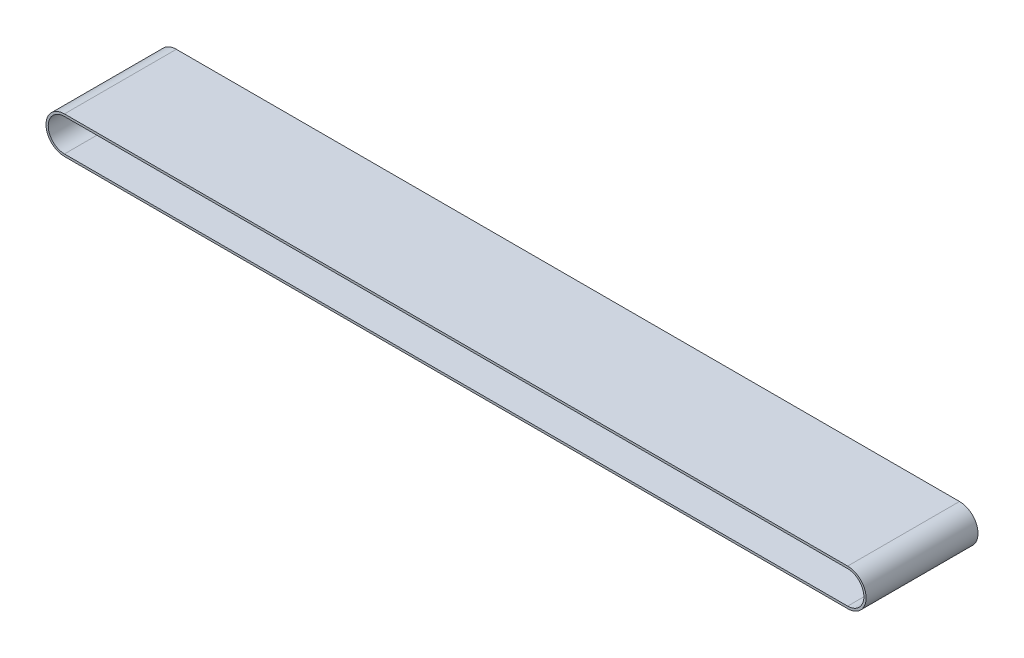
ISO-10303-21;
HEADER;
FILE_DESCRIPTION(('STEP AP214'),'2;1');
FILE_NAME('part.step','',(''),(''),'','','');
FILE_SCHEMA(('AUTOMOTIVE_DESIGN { 1 0 10303 214 1 1 1 1 }'));
ENDSEC;
DATA;
#1=APPLICATION_CONTEXT('core data for automotive mechanical design processes');
#2=APPLICATION_PROTOCOL_DEFINITION('international standard','automotive_design',2000,#1);
#3=PRODUCT_CONTEXT('',#1,'mechanical');
#4=PRODUCT('Part','Part','',(#3));
#5=PRODUCT_RELATED_PRODUCT_CATEGORY('part','',(#4));
#6=PRODUCT_DEFINITION_FORMATION('','',#4);
#7=PRODUCT_DEFINITION_CONTEXT('part definition',#1,'design');
#8=PRODUCT_DEFINITION('design','',#6,#7);
#9=PRODUCT_DEFINITION_SHAPE('','',#8);
#10=(LENGTH_UNIT() NAMED_UNIT(*) SI_UNIT(.MILLI.,.METRE.));
#11=(NAMED_UNIT(*) PLANE_ANGLE_UNIT() SI_UNIT($,.RADIAN.));
#12=(NAMED_UNIT(*) SI_UNIT($,.STERADIAN.) SOLID_ANGLE_UNIT());
#13=UNCERTAINTY_MEASURE_WITH_UNIT(LENGTH_MEASURE(1.E-05),#10,'distance_accuracy_value','');
#14=(GEOMETRIC_REPRESENTATION_CONTEXT(3) GLOBAL_UNCERTAINTY_ASSIGNED_CONTEXT((#13)) GLOBAL_UNIT_ASSIGNED_CONTEXT((#10,
#11,#12)) REPRESENTATION_CONTEXT('',''));
#15=CARTESIAN_POINT('',(0.,0.,0.));
#16=DIRECTION('',(0.,0.,1.));
#17=DIRECTION('',(1.,0.,0.));
#18=AXIS2_PLACEMENT_3D('',#15,#16,#17);
#19=CARTESIAN_POINT('',(-2.56045185054177E-12,-3.33066907387547E-13,50.));
#20=DIRECTION('',(0.,0.,-1.));
#21=DIRECTION('',(-1.,0.,0.));
#22=AXIS2_PLACEMENT_3D('',#19,#20,#21);
#23=PLANE('',#22);
#24=CARTESIAN_POINT('',(-2.56045185054177E-12,-3.33066907387547E-13,50.));
#25=DIRECTION('',(0.,0.,-1.));
#26=DIRECTION('',(-1.,0.,0.));
#27=AXIS2_PLACEMENT_3D('',#24,#25,#26);
#28=CIRCLE('',#27,16.5);
#29=CARTESIAN_POINT('',(-2.5630688048141E-12,-16.5000000000003,50.));
#30=VERTEX_POINT('',#29);
#31=CARTESIAN_POINT('',(-2.55351295663786E-12,16.4999999999997,50.));
#32=VERTEX_POINT('',#31);
#33=EDGE_CURVE('E157',#30,#32,#28,.F.);
#34=ORIENTED_EDGE('',*,*,#33,.T.);
#35=DIRECTION('',(-1.,0.,0.));
#36=VECTOR('',#35,1.);
#37=CARTESIAN_POINT('',(-2.55783489626944E-12,16.4999999999997,50.));
#38=LINE('',#37,#36);
#39=CARTESIAN_POINT('',(-700.,16.4999999999998,50.));
#40=VERTEX_POINT('',#39);
#41=EDGE_CURVE('E160',#32,#40,#38,.T.);
#42=ORIENTED_EDGE('',*,*,#41,.T.);
#43=CARTESIAN_POINT('',(-700.,-2.22044604925031E-13,50.));
#44=DIRECTION('',(0.,0.,-1.));
#45=DIRECTION('',(-1.,0.,0.));
#46=AXIS2_PLACEMENT_3D('',#43,#44,#45);
#47=CIRCLE('',#46,16.5);
#48=CARTESIAN_POINT('',(-700.,-16.5000000000002,50.));
#49=VERTEX_POINT('',#48);
#50=EDGE_CURVE('E163',#40,#49,#47,.F.);
#51=ORIENTED_EDGE('',*,*,#50,.T.);
#52=DIRECTION('',(1.,0.,0.));
#53=VECTOR('',#52,1.);
#54=CARTESIAN_POINT('',(-2.5630688048141E-12,-16.5000000000003,50.));
#55=LINE('',#54,#53);
#56=EDGE_CURVE('E165',#49,#30,#55,.T.);
#57=ORIENTED_EDGE('',*,*,#56,.T.);
#58=EDGE_LOOP('',(#34,#42,#51,#57));
#59=FACE_BOUND('',#58,.T.);
#60=CARTESIAN_POINT('',(-2.56045185054177E-12,-3.33066907387547E-13,50.));
#61=DIRECTION('',(0.,0.,1.));
#62=DIRECTION('',(-1.,0.,0.));
#63=AXIS2_PLACEMENT_3D('',#60,#61,#62);
#64=CIRCLE('',#63,14.5);
#65=CARTESIAN_POINT('',(-2.56275159823563E-12,-14.5000000000003,50.));
#66=VERTEX_POINT('',#65);
#67=CARTESIAN_POINT('',(-2.5581521028479E-12,14.4999999999997,50.));
#68=VERTEX_POINT('',#67);
#69=EDGE_CURVE('E121',#66,#68,#64,.T.);
#70=ORIENTED_EDGE('',*,*,#69,.F.);
#71=DIRECTION('',(1.,0.,0.));
#72=VECTOR('',#71,1.);
#73=CARTESIAN_POINT('',(-2.56275159823563E-12,-14.5000000000003,50.));
#74=LINE('',#73,#72);
#75=CARTESIAN_POINT('',(-700.,-14.5000000000002,50.));
#76=VERTEX_POINT('',#75);
#77=EDGE_CURVE('E143',#76,#66,#74,.T.);
#78=ORIENTED_EDGE('',*,*,#77,.F.);
#79=CARTESIAN_POINT('',(-700.,-2.22044604925031E-13,50.));
#80=DIRECTION('',(0.,0.,1.));
#81=DIRECTION('',(-1.,0.,0.));
#82=AXIS2_PLACEMENT_3D('',#79,#80,#81);
#83=CIRCLE('',#82,14.5);
#84=CARTESIAN_POINT('',(-700.,14.4999999999998,50.));
#85=VERTEX_POINT('',#84);
#86=EDGE_CURVE('E141',#85,#76,#83,.T.);
#87=ORIENTED_EDGE('',*,*,#86,.F.);
#88=DIRECTION('',(-1.,0.,0.));
#89=VECTOR('',#88,1.);
#90=CARTESIAN_POINT('',(-700.,14.4999999999998,50.));
#91=LINE('',#90,#89);
#92=EDGE_CURVE('E129',#68,#85,#91,.T.);
#93=ORIENTED_EDGE('',*,*,#92,.F.);
#94=EDGE_LOOP('',(#70,#78,#87,#93));
#95=FACE_BOUND('',#94,.T.);
#96=ADVANCED_FACE('F56',(#59,#95),#23,.F.);
#97=CARTESIAN_POINT('',(-2.56045185054177E-12,-3.33066907387547E-13,-50.));
#98=DIRECTION('',(0.,0.,-1.));
#99=DIRECTION('',(-1.,0.,0.));
#100=AXIS2_PLACEMENT_3D('',#97,#98,#99);
#101=PLANE('',#100);
#102=CARTESIAN_POINT('',(-2.56045185054177E-12,-3.33066907387547E-13,-50.));
#103=DIRECTION('',(0.,0.,-1.));
#104=DIRECTION('',(-1.,0.,0.));
#105=AXIS2_PLACEMENT_3D('',#102,#103,#104);
#106=CIRCLE('',#105,16.5);
#107=CARTESIAN_POINT('',(-2.5630688048141E-12,-16.5000000000003,-50.));
#108=VERTEX_POINT('',#107);
#109=CARTESIAN_POINT('',(-2.55351295663786E-12,16.4999999999997,-50.));
#110=VERTEX_POINT('',#109);
#111=EDGE_CURVE('E137',#108,#110,#106,.F.);
#112=ORIENTED_EDGE('',*,*,#111,.F.);
#113=DIRECTION('',(1.,0.,0.));
#114=VECTOR('',#113,1.);
#115=CARTESIAN_POINT('',(-2.5630688048141E-12,-16.5000000000003,-50.));
#116=LINE('',#115,#114);
#117=CARTESIAN_POINT('',(-700.,-16.5000000000002,-50.));
#118=VERTEX_POINT('',#117);
#119=EDGE_CURVE('E161',#118,#108,#116,.T.);
#120=ORIENTED_EDGE('',*,*,#119,.F.);
#121=CARTESIAN_POINT('',(-700.,-2.22044604925031E-13,-50.));
#122=DIRECTION('',(0.,0.,-1.));
#123=DIRECTION('',(-1.,0.,0.));
#124=AXIS2_PLACEMENT_3D('',#121,#122,#123);
#125=CIRCLE('',#124,16.5);
#126=CARTESIAN_POINT('',(-700.,16.4999999999998,-50.));
#127=VERTEX_POINT('',#126);
#128=EDGE_CURVE('E172',#127,#118,#125,.F.);
#129=ORIENTED_EDGE('',*,*,#128,.F.);
#130=DIRECTION('',(-1.,0.,0.));
#131=VECTOR('',#130,1.);
#132=CARTESIAN_POINT('',(-2.55783489626944E-12,16.4999999999997,-50.));
#133=LINE('',#132,#131);
#134=EDGE_CURVE('E170',#110,#127,#133,.T.);
#135=ORIENTED_EDGE('',*,*,#134,.F.);
#136=EDGE_LOOP('',(#112,#120,#129,#135));
#137=FACE_BOUND('',#136,.T.);
#138=DIRECTION('',(1.,0.,0.));
#139=VECTOR('',#138,1.);
#140=CARTESIAN_POINT('',(-2.56275159823563E-12,-14.5000000000003,-50.));
#141=LINE('',#140,#139);
#142=CARTESIAN_POINT('',(-700.,-14.5000000000002,-50.));
#143=VERTEX_POINT('',#142);
#144=CARTESIAN_POINT('',(-2.56275159823563E-12,-14.5000000000003,-50.));
#145=VERTEX_POINT('',#144);
#146=EDGE_CURVE('E130',#143,#145,#141,.T.);
#147=ORIENTED_EDGE('',*,*,#146,.T.);
#148=CARTESIAN_POINT('',(-2.56045185054177E-12,-3.33066907387547E-13,-50.));
#149=DIRECTION('',(0.,0.,1.));
#150=DIRECTION('',(-1.,0.,0.));
#151=AXIS2_PLACEMENT_3D('',#148,#149,#150);
#152=CIRCLE('',#151,14.5);
#153=CARTESIAN_POINT('',(-2.5581521028479E-12,14.4999999999997,-50.));
#154=VERTEX_POINT('',#153);
#155=EDGE_CURVE('E79',#145,#154,#152,.T.);
#156=ORIENTED_EDGE('',*,*,#155,.T.);
#157=DIRECTION('',(-1.,0.,0.));
#158=VECTOR('',#157,1.);
#159=CARTESIAN_POINT('',(-700.,14.4999999999998,-50.));
#160=LINE('',#159,#158);
#161=CARTESIAN_POINT('',(-700.,14.4999999999998,-50.));
#162=VERTEX_POINT('',#161);
#163=EDGE_CURVE('E136',#154,#162,#160,.T.);
#164=ORIENTED_EDGE('',*,*,#163,.T.);
#165=CARTESIAN_POINT('',(-700.,-2.22044604925031E-13,-50.));
#166=DIRECTION('',(0.,0.,1.));
#167=DIRECTION('',(-1.,0.,0.));
#168=AXIS2_PLACEMENT_3D('',#165,#166,#167);
#169=CIRCLE('',#168,14.5);
#170=EDGE_CURVE('E149',#162,#143,#169,.T.);
#171=ORIENTED_EDGE('',*,*,#170,.T.);
#172=EDGE_LOOP('',(#147,#156,#164,#171));
#173=FACE_BOUND('',#172,.T.);
#174=ADVANCED_FACE('F190',(#137,#173),#101,.T.);
#175=CARTESIAN_POINT('',(-2.56045185054177E-12,-3.33066907387547E-13,50.));
#176=DIRECTION('',(0.,0.,-1.));
#177=DIRECTION('',(-1.,0.,0.));
#178=AXIS2_PLACEMENT_3D('',#175,#176,#177);
#179=CYLINDRICAL_SURFACE('',#178,16.5);
#180=ORIENTED_EDGE('',*,*,#111,.T.);
#181=DIRECTION('',(0.,0.,-1.));
#182=VECTOR('',#181,1.);
#183=CARTESIAN_POINT('',(-2.55351295663786E-12,16.4999999999997,50.));
#184=LINE('',#183,#182);
#185=EDGE_CURVE('E12',#32,#110,#184,.T.);
#186=ORIENTED_EDGE('',*,*,#185,.F.);
#187=ORIENTED_EDGE('',*,*,#33,.F.);
#188=DIRECTION('',(0.,0.,-1.));
#189=VECTOR('',#188,1.);
#190=CARTESIAN_POINT('',(-2.5630688048141E-12,-16.5000000000003,50.));
#191=LINE('',#190,#189);
#192=EDGE_CURVE('E167',#30,#108,#191,.T.);
#193=ORIENTED_EDGE('',*,*,#192,.T.);
#194=EDGE_LOOP('',(#180,#186,#187,#193));
#195=FACE_BOUND('',#194,.T.);
#196=ADVANCED_FACE('F58',(#195),#179,.T.);
#197=CARTESIAN_POINT('',(-2.55783489626944E-12,16.4999999999997,50.));
#198=DIRECTION('',(0.,-1.,0.));
#199=DIRECTION('',(1.,0.,0.));
#200=AXIS2_PLACEMENT_3D('',#197,#198,#199);
#201=PLANE('',#200);
#202=ORIENTED_EDGE('',*,*,#134,.T.);
#203=DIRECTION('',(0.,0.,-1.));
#204=VECTOR('',#203,1.);
#205=CARTESIAN_POINT('',(-700.,16.4999999999998,50.));
#206=LINE('',#205,#204);
#207=EDGE_CURVE('E64',#40,#127,#206,.T.);
#208=ORIENTED_EDGE('',*,*,#207,.F.);
#209=ORIENTED_EDGE('',*,*,#41,.F.);
#210=ORIENTED_EDGE('',*,*,#185,.T.);
#211=EDGE_LOOP('',(#202,#208,#209,#210));
#212=FACE_BOUND('',#211,.T.);
#213=ADVANCED_FACE('F200',(#212),#201,.F.);
#214=CARTESIAN_POINT('',(-700.,-2.22044604925031E-13,50.));
#215=DIRECTION('',(0.,0.,-1.));
#216=DIRECTION('',(-1.,0.,0.));
#217=AXIS2_PLACEMENT_3D('',#214,#215,#216);
#218=CYLINDRICAL_SURFACE('',#217,16.5);
#219=ORIENTED_EDGE('',*,*,#128,.T.);
#220=DIRECTION('',(0.,0.,-1.));
#221=VECTOR('',#220,1.);
#222=CARTESIAN_POINT('',(-700.,-16.5000000000002,50.));
#223=LINE('',#222,#221);
#224=EDGE_CURVE('E177',#49,#118,#223,.T.);
#225=ORIENTED_EDGE('',*,*,#224,.F.);
#226=ORIENTED_EDGE('',*,*,#50,.F.);
#227=ORIENTED_EDGE('',*,*,#207,.T.);
#228=EDGE_LOOP('',(#219,#225,#226,#227));
#229=FACE_BOUND('',#228,.T.);
#230=ADVANCED_FACE('F184',(#229),#218,.T.);
#231=CARTESIAN_POINT('',(-2.5630688048141E-12,-16.5000000000003,50.));
#232=DIRECTION('',(0.,1.,0.));
#233=DIRECTION('',(-1.,0.,0.));
#234=AXIS2_PLACEMENT_3D('',#231,#232,#233);
#235=PLANE('',#234);
#236=ORIENTED_EDGE('',*,*,#119,.T.);
#237=ORIENTED_EDGE('',*,*,#192,.F.);
#238=ORIENTED_EDGE('',*,*,#56,.F.);
#239=ORIENTED_EDGE('',*,*,#224,.T.);
#240=EDGE_LOOP('',(#236,#237,#238,#239));
#241=FACE_BOUND('',#240,.T.);
#242=ADVANCED_FACE('F194',(#241),#235,.F.);
#243=CARTESIAN_POINT('',(-2.56045185054177E-12,-3.33066907387547E-13,50.));
#244=DIRECTION('',(0.,0.,-1.));
#245=DIRECTION('',(-1.,0.,0.));
#246=AXIS2_PLACEMENT_3D('',#243,#244,#245);
#247=CYLINDRICAL_SURFACE('',#246,14.5);
#248=ORIENTED_EDGE('',*,*,#155,.F.);
#249=DIRECTION('',(0.,0.,-1.));
#250=VECTOR('',#249,1.);
#251=CARTESIAN_POINT('',(-2.56275159823563E-12,-14.5000000000003,50.));
#252=LINE('',#251,#250);
#253=EDGE_CURVE('E125',#66,#145,#252,.T.);
#254=ORIENTED_EDGE('',*,*,#253,.F.);
#255=ORIENTED_EDGE('',*,*,#69,.T.);
#256=DIRECTION('',(0.,0.,-1.));
#257=VECTOR('',#256,1.);
#258=CARTESIAN_POINT('',(-2.5581521028479E-12,14.4999999999997,50.));
#259=LINE('',#258,#257);
#260=EDGE_CURVE('E124',#68,#154,#259,.T.);
#261=ORIENTED_EDGE('',*,*,#260,.T.);
#262=EDGE_LOOP('',(#248,#254,#255,#261));
#263=FACE_BOUND('',#262,.T.);
#264=ADVANCED_FACE('F123',(#263),#247,.F.);
#265=CARTESIAN_POINT('',(-700.,14.4999999999998,50.));
#266=DIRECTION('',(0.,-1.,0.));
#267=DIRECTION('',(1.,0.,0.));
#268=AXIS2_PLACEMENT_3D('',#265,#266,#267);
#269=PLANE('',#268);
#270=ORIENTED_EDGE('',*,*,#163,.F.);
#271=ORIENTED_EDGE('',*,*,#260,.F.);
#272=ORIENTED_EDGE('',*,*,#92,.T.);
#273=DIRECTION('',(0.,0.,-1.));
#274=VECTOR('',#273,1.);
#275=CARTESIAN_POINT('',(-700.,14.4999999999998,50.));
#276=LINE('',#275,#274);
#277=EDGE_CURVE('E138',#85,#162,#276,.T.);
#278=ORIENTED_EDGE('',*,*,#277,.T.);
#279=EDGE_LOOP('',(#270,#271,#272,#278));
#280=FACE_BOUND('',#279,.T.);
#281=ADVANCED_FACE('F133',(#280),#269,.T.);
#282=CARTESIAN_POINT('',(-700.,-2.22044604925031E-13,50.));
#283=DIRECTION('',(0.,0.,-1.));
#284=DIRECTION('',(-1.,0.,0.));
#285=AXIS2_PLACEMENT_3D('',#282,#283,#284);
#286=CYLINDRICAL_SURFACE('',#285,14.5);
#287=ORIENTED_EDGE('',*,*,#170,.F.);
#288=ORIENTED_EDGE('',*,*,#277,.F.);
#289=ORIENTED_EDGE('',*,*,#86,.T.);
#290=DIRECTION('',(0.,0.,-1.));
#291=VECTOR('',#290,1.);
#292=CARTESIAN_POINT('',(-700.,-14.5000000000002,50.));
#293=LINE('',#292,#291);
#294=EDGE_CURVE('E71',#76,#143,#293,.T.);
#295=ORIENTED_EDGE('',*,*,#294,.T.);
#296=EDGE_LOOP('',(#287,#288,#289,#295));
#297=FACE_BOUND('',#296,.T.);
#298=ADVANCED_FACE('F223',(#297),#286,.F.);
#299=CARTESIAN_POINT('',(-2.56275159823563E-12,-14.5000000000003,50.));
#300=DIRECTION('',(0.,1.,0.));
#301=DIRECTION('',(-1.,0.,0.));
#302=AXIS2_PLACEMENT_3D('',#299,#300,#301);
#303=PLANE('',#302);
#304=ORIENTED_EDGE('',*,*,#146,.F.);
#305=ORIENTED_EDGE('',*,*,#294,.F.);
#306=ORIENTED_EDGE('',*,*,#77,.T.);
#307=ORIENTED_EDGE('',*,*,#253,.T.);
#308=EDGE_LOOP('',(#304,#305,#306,#307));
#309=FACE_BOUND('',#308,.T.);
#310=ADVANCED_FACE('F227',(#309),#303,.T.);
#311=CLOSED_SHELL('',(#96,#174,#196,#213,#230,#242,#264,#281,#298,#310));
#312=MANIFOLD_SOLID_BREP('B2',#311);
#313=ADVANCED_BREP_SHAPE_REPRESENTATION('',(#18,#312),#14);
#314=SHAPE_DEFINITION_REPRESENTATION(#9,#313);
ENDSEC;
END-ISO-10303-21;
